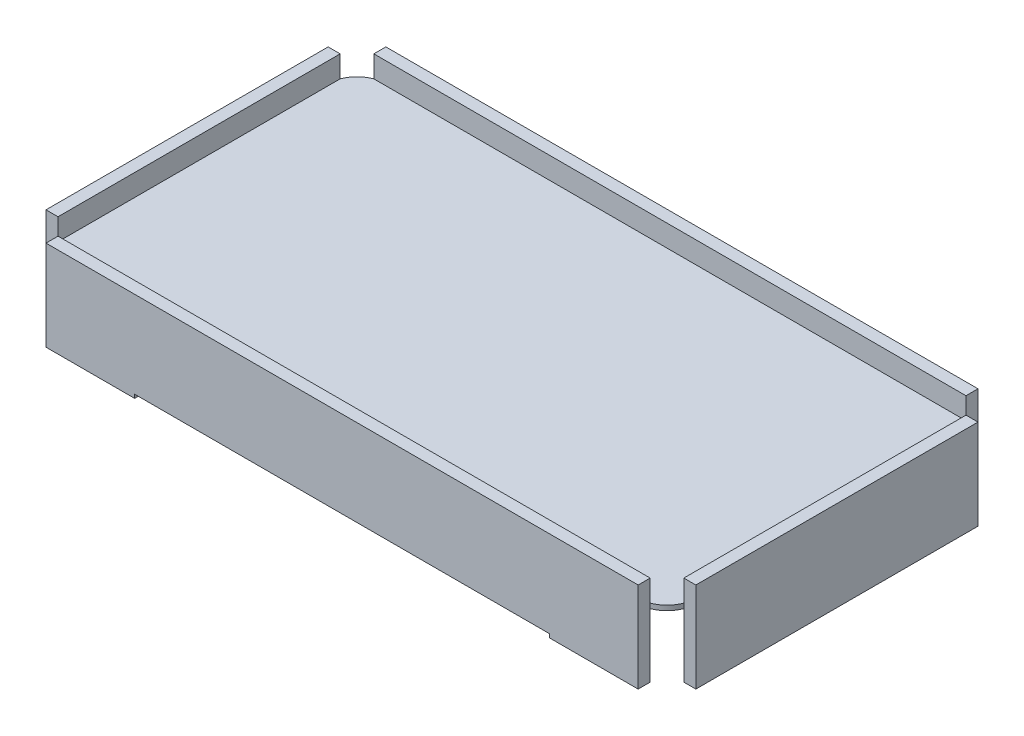
ISO-10303-21;
HEADER;
FILE_DESCRIPTION(('STEP AP214'),'2;1');
FILE_NAME('part.step','',(''),(''),'','','');
FILE_SCHEMA(('AUTOMOTIVE_DESIGN { 1 0 10303 214 1 1 1 1 }'));
ENDSEC;
DATA;
#1=APPLICATION_CONTEXT('core data for automotive mechanical design processes');
#2=APPLICATION_PROTOCOL_DEFINITION('international standard','automotive_design',2000,#1);
#3=PRODUCT_CONTEXT('',#1,'mechanical');
#4=PRODUCT('Part','Part','',(#3));
#5=PRODUCT_RELATED_PRODUCT_CATEGORY('part','',(#4));
#6=PRODUCT_DEFINITION_FORMATION('','',#4);
#7=PRODUCT_DEFINITION_CONTEXT('part definition',#1,'design');
#8=PRODUCT_DEFINITION('design','',#6,#7);
#9=PRODUCT_DEFINITION_SHAPE('','',#8);
#10=(LENGTH_UNIT() NAMED_UNIT(*) SI_UNIT(.MILLI.,.METRE.));
#11=(NAMED_UNIT(*) PLANE_ANGLE_UNIT() SI_UNIT($,.RADIAN.));
#12=(NAMED_UNIT(*) SI_UNIT($,.STERADIAN.) SOLID_ANGLE_UNIT());
#13=UNCERTAINTY_MEASURE_WITH_UNIT(LENGTH_MEASURE(1.E-05),#10,'distance_accuracy_value','');
#14=(GEOMETRIC_REPRESENTATION_CONTEXT(3) GLOBAL_UNCERTAINTY_ASSIGNED_CONTEXT((#13)) GLOBAL_UNIT_ASSIGNED_CONTEXT((#10,
#11,#12)) REPRESENTATION_CONTEXT('',''));
#15=CARTESIAN_POINT('',(0.,0.,0.));
#16=DIRECTION('',(0.,0.,1.));
#17=DIRECTION('',(1.,0.,0.));
#18=AXIS2_PLACEMENT_3D('',#15,#16,#17);
#19=CARTESIAN_POINT('',(0.,0.,0.));
#20=DIRECTION('',(0.,1.,0.));
#21=DIRECTION('',(0.,0.,1.));
#22=AXIS2_PLACEMENT_3D('',#19,#20,#21);
#23=PLANE('',#22);
#24=DIRECTION('',(0.,0.,-1.));
#25=VECTOR('',#24,1.);
#26=CARTESIAN_POINT('',(-215.725,0.,176.75));
#27=LINE('',#26,#25);
#28=CARTESIAN_POINT('',(-215.725,0.,-164.25));
#29=VERTEX_POINT('',#28);
#30=CARTESIAN_POINT('',(-215.725,0.,-176.75));
#31=VERTEX_POINT('',#30);
#32=EDGE_CURVE('E279',#29,#31,#27,.T.);
#33=ORIENTED_EDGE('',*,*,#32,.F.);
#34=DIRECTION('',(1.,0.,0.));
#35=VECTOR('',#34,1.);
#36=CARTESIAN_POINT('',(0.,0.,-164.25));
#37=LINE('',#36,#35);
#38=CARTESIAN_POINT('',(-307.975,0.,-164.25));
#39=VERTEX_POINT('',#38);
#40=EDGE_CURVE('E391',#39,#29,#37,.T.);
#41=ORIENTED_EDGE('',*,*,#40,.F.);
#42=DIRECTION('',(0.,0.,-1.));
#43=VECTOR('',#42,1.);
#44=CARTESIAN_POINT('',(-307.975,0.,0.));
#45=LINE('',#44,#43);
#46=CARTESIAN_POINT('',(-307.975,0.,-176.75));
#47=VERTEX_POINT('',#46);
#48=EDGE_CURVE('E367',#39,#47,#45,.T.);
#49=ORIENTED_EDGE('',*,*,#48,.T.);
#50=DIRECTION('',(1.,0.,0.));
#51=VECTOR('',#50,1.);
#52=CARTESIAN_POINT('',(0.,0.,-176.75));
#53=LINE('',#52,#51);
#54=EDGE_CURVE('E376',#47,#31,#53,.T.);
#55=ORIENTED_EDGE('',*,*,#54,.T.);
#56=EDGE_LOOP('',(#33,#41,#49,#55));
#57=FACE_BOUND('',#56,.T.);
#58=ADVANCED_FACE('F44',(#57),#23,.F.);
#59=CARTESIAN_POINT('',(0.,0.,0.));
#60=DIRECTION('',(0.,1.,0.));
#61=DIRECTION('',(0.,0.,1.));
#62=AXIS2_PLACEMENT_3D('',#59,#60,#61);
#63=PLANE('',#62);
#64=CARTESIAN_POINT('',(-215.725,0.,176.75));
#65=VERTEX_POINT('',#64);
#66=CARTESIAN_POINT('',(-215.725,0.,164.25));
#67=VERTEX_POINT('',#66);
#68=EDGE_CURVE('E256',#65,#67,#27,.T.);
#69=ORIENTED_EDGE('',*,*,#68,.F.);
#70=DIRECTION('',(-1.,0.,0.));
#71=VECTOR('',#70,1.);
#72=CARTESIAN_POINT('',(0.,0.,176.75));
#73=LINE('',#72,#71);
#74=CARTESIAN_POINT('',(-307.975,0.,176.75));
#75=VERTEX_POINT('',#74);
#76=EDGE_CURVE('E272',#65,#75,#73,.T.);
#77=ORIENTED_EDGE('',*,*,#76,.T.);
#78=DIRECTION('',(0.,0.,-1.));
#79=VECTOR('',#78,1.);
#80=CARTESIAN_POINT('',(-307.975,0.,0.));
#81=LINE('',#80,#79);
#82=CARTESIAN_POINT('',(-307.975,0.,164.25));
#83=VERTEX_POINT('',#82);
#84=EDGE_CURVE('E290',#75,#83,#81,.T.);
#85=ORIENTED_EDGE('',*,*,#84,.T.);
#86=DIRECTION('',(-1.,0.,0.));
#87=VECTOR('',#86,1.);
#88=CARTESIAN_POINT('',(0.,0.,164.25));
#89=LINE('',#88,#87);
#90=EDGE_CURVE('E274',#67,#83,#89,.T.);
#91=ORIENTED_EDGE('',*,*,#90,.F.);
#92=EDGE_LOOP('',(#69,#77,#85,#91));
#93=FACE_BOUND('',#92,.T.);
#94=ADVANCED_FACE('F271',(#93),#63,.F.);
#95=CARTESIAN_POINT('',(0.,93.8,-164.25));
#96=DIRECTION('',(0.,0.,-1.));
#97=DIRECTION('',(-1.,0.,0.));
#98=AXIS2_PLACEMENT_3D('',#95,#96,#97);
#99=PLANE('',#98);
#100=DIRECTION('',(0.,1.,0.));
#101=VECTOR('',#100,1.);
#102=CARTESIAN_POINT('',(215.725,93.8,-164.25));
#103=LINE('',#102,#101);
#104=CARTESIAN_POINT('',(215.725,0.,-164.25));
#105=VERTEX_POINT('',#104);
#106=CARTESIAN_POINT('',(215.725,3.80000000000002,-164.25));
#107=VERTEX_POINT('',#106);
#108=EDGE_CURVE('E291',#105,#107,#103,.T.);
#109=ORIENTED_EDGE('',*,*,#108,.F.);
#110=CARTESIAN_POINT('',(307.975,0.,-164.25));
#111=VERTEX_POINT('',#110);
#112=EDGE_CURVE('E388',#105,#111,#37,.T.);
#113=ORIENTED_EDGE('',*,*,#112,.T.);
#114=DIRECTION('',(0.,-1.,0.));
#115=VECTOR('',#114,1.);
#116=CARTESIAN_POINT('',(307.975,93.8,-164.25));
#117=LINE('',#116,#115);
#118=CARTESIAN_POINT('',(307.975,66.25,-164.25));
#119=VERTEX_POINT('',#118);
#120=EDGE_CURVE('E408',#119,#111,#117,.T.);
#121=ORIENTED_EDGE('',*,*,#120,.F.);
#122=DIRECTION('',(-1.,0.,0.));
#123=VECTOR('',#122,1.);
#124=CARTESIAN_POINT('',(-325.475,66.25,-164.25));
#125=LINE('',#124,#123);
#126=CARTESIAN_POINT('',(-307.975,66.25,-164.25));
#127=VERTEX_POINT('',#126);
#128=EDGE_CURVE('E440',#119,#127,#125,.T.);
#129=ORIENTED_EDGE('',*,*,#128,.T.);
#130=DIRECTION('',(0.,-1.,0.));
#131=VECTOR('',#130,1.);
#132=CARTESIAN_POINT('',(-307.975,93.8,-164.25));
#133=LINE('',#132,#131);
#134=EDGE_CURVE('E414',#127,#39,#133,.T.);
#135=ORIENTED_EDGE('',*,*,#134,.T.);
#136=ORIENTED_EDGE('',*,*,#40,.T.);
#137=DIRECTION('',(0.,1.,0.));
#138=VECTOR('',#137,1.);
#139=CARTESIAN_POINT('',(-215.725,93.8,-164.25));
#140=LINE('',#139,#138);
#141=CARTESIAN_POINT('',(-215.725,3.80000000000002,-164.25));
#142=VERTEX_POINT('',#141);
#143=EDGE_CURVE('E550',#29,#142,#140,.T.);
#144=ORIENTED_EDGE('',*,*,#143,.T.);
#145=DIRECTION('',(-1.,0.,0.));
#146=VECTOR('',#145,1.);
#147=CARTESIAN_POINT('',(0.,3.80000000000001,-164.25));
#148=LINE('',#147,#146);
#149=EDGE_CURVE('E543',#107,#142,#148,.T.);
#150=ORIENTED_EDGE('',*,*,#149,.F.);
#151=EDGE_LOOP('',(#109,#113,#121,#129,#135,#136,#144,#150));
#152=FACE_BOUND('',#151,.T.);
#153=ADVANCED_FACE('F637',(#152),#99,.F.);
#154=CARTESIAN_POINT('',(0.,93.8,164.25));
#155=DIRECTION('',(0.,0.,1.));
#156=DIRECTION('',(1.,0.,0.));
#157=AXIS2_PLACEMENT_3D('',#154,#155,#156);
#158=PLANE('',#157);
#159=DIRECTION('',(0.,-1.,0.));
#160=VECTOR('',#159,1.);
#161=CARTESIAN_POINT('',(215.725,93.8,164.25));
#162=LINE('',#161,#160);
#163=CARTESIAN_POINT('',(215.725,3.80000000000002,164.25));
#164=VERTEX_POINT('',#163);
#165=CARTESIAN_POINT('',(215.725,0.,164.25));
#166=VERTEX_POINT('',#165);
#167=EDGE_CURVE('E11',#164,#166,#162,.T.);
#168=ORIENTED_EDGE('',*,*,#167,.F.);
#169=DIRECTION('',(1.,0.,0.));
#170=VECTOR('',#169,1.);
#171=CARTESIAN_POINT('',(0.,3.80000000000001,164.25));
#172=LINE('',#171,#170);
#173=CARTESIAN_POINT('',(-215.725,3.80000000000002,164.25));
#174=VERTEX_POINT('',#173);
#175=EDGE_CURVE('E533',#174,#164,#172,.T.);
#176=ORIENTED_EDGE('',*,*,#175,.F.);
#177=DIRECTION('',(0.,-1.,0.));
#178=VECTOR('',#177,1.);
#179=CARTESIAN_POINT('',(-215.725,93.8,164.25));
#180=LINE('',#179,#178);
#181=EDGE_CURVE('E53',#174,#67,#180,.T.);
#182=ORIENTED_EDGE('',*,*,#181,.T.);
#183=ORIENTED_EDGE('',*,*,#90,.T.);
#184=DIRECTION('',(0.,-1.,0.));
#185=VECTOR('',#184,1.);
#186=CARTESIAN_POINT('',(-307.975,93.8,164.25));
#187=LINE('',#186,#185);
#188=CARTESIAN_POINT('',(-307.975,66.25,164.25));
#189=VERTEX_POINT('',#188);
#190=EDGE_CURVE('E309',#189,#83,#187,.T.);
#191=ORIENTED_EDGE('',*,*,#190,.F.);
#192=DIRECTION('',(1.,0.,0.));
#193=VECTOR('',#192,1.);
#194=CARTESIAN_POINT('',(-325.475,66.25,164.25));
#195=LINE('',#194,#193);
#196=CARTESIAN_POINT('',(307.975,66.25,164.25));
#197=VERTEX_POINT('',#196);
#198=EDGE_CURVE('E428',#189,#197,#195,.T.);
#199=ORIENTED_EDGE('',*,*,#198,.T.);
#200=DIRECTION('',(0.,-1.,0.));
#201=VECTOR('',#200,1.);
#202=CARTESIAN_POINT('',(307.975,93.8,164.25));
#203=LINE('',#202,#201);
#204=CARTESIAN_POINT('',(307.975,0.,164.25));
#205=VERTEX_POINT('',#204);
#206=EDGE_CURVE('E310',#197,#205,#203,.T.);
#207=ORIENTED_EDGE('',*,*,#206,.T.);
#208=EDGE_CURVE('E299',#205,#166,#89,.T.);
#209=ORIENTED_EDGE('',*,*,#208,.T.);
#210=EDGE_LOOP('',(#168,#176,#182,#183,#191,#199,#207,#209));
#211=FACE_BOUND('',#210,.T.);
#212=ADVANCED_FACE('F530',(#211),#158,.F.);
#213=CARTESIAN_POINT('',(-325.475,93.8,0.));
#214=DIRECTION('',(-1.,0.,0.));
#215=DIRECTION('',(0.,0.,1.));
#216=AXIS2_PLACEMENT_3D('',#213,#214,#215);
#217=PLANE('',#216);
#218=DIRECTION('',(0.,0.,1.));
#219=VECTOR('',#218,1.);
#220=CARTESIAN_POINT('',(-325.475,71.25,-164.25));
#221=LINE('',#220,#219);
#222=CARTESIAN_POINT('',(-325.475,71.25,-146.75));
#223=VERTEX_POINT('',#222);
#224=CARTESIAN_POINT('',(-325.475,71.25,146.75));
#225=VERTEX_POINT('',#224);
#226=EDGE_CURVE('E426',#223,#225,#221,.T.);
#227=ORIENTED_EDGE('',*,*,#226,.F.);
#228=DIRECTION('',(0.,-1.,0.));
#229=VECTOR('',#228,1.);
#230=CARTESIAN_POINT('',(-325.475,93.8,-146.75));
#231=LINE('',#230,#229);
#232=CARTESIAN_POINT('',(-325.475,93.8,-146.75));
#233=VERTEX_POINT('',#232);
#234=EDGE_CURVE('E486',#233,#223,#231,.T.);
#235=ORIENTED_EDGE('',*,*,#234,.F.);
#236=DIRECTION('',(0.,0.,-1.));
#237=VECTOR('',#236,1.);
#238=CARTESIAN_POINT('',(-325.475,93.8,0.));
#239=LINE('',#238,#237);
#240=CARTESIAN_POINT('',(-325.475,93.8,146.75));
#241=VERTEX_POINT('',#240);
#242=EDGE_CURVE('E468',#241,#233,#239,.T.);
#243=ORIENTED_EDGE('',*,*,#242,.F.);
#244=DIRECTION('',(0.,-1.,0.));
#245=VECTOR('',#244,1.);
#246=CARTESIAN_POINT('',(-325.475,93.8,146.75));
#247=LINE('',#246,#245);
#248=EDGE_CURVE('E495',#241,#225,#247,.T.);
#249=ORIENTED_EDGE('',*,*,#248,.T.);
#250=EDGE_LOOP('',(#227,#235,#243,#249));
#251=FACE_BOUND('',#250,.T.);
#252=ADVANCED_FACE('F744',(#251),#217,.F.);
#253=CARTESIAN_POINT('',(0.,93.8,-146.75));
#254=DIRECTION('',(0.,0.,-1.));
#255=DIRECTION('',(-1.,0.,0.));
#256=AXIS2_PLACEMENT_3D('',#253,#254,#255);
#257=PLANE('',#256);
#258=DIRECTION('',(1.,0.,0.));
#259=VECTOR('',#258,1.);
#260=CARTESIAN_POINT('',(0.,0.,-146.75));
#261=LINE('',#260,#259);
#262=CARTESIAN_POINT('',(-337.975,0.,-146.75));
#263=VERTEX_POINT('',#262);
#264=CARTESIAN_POINT('',(-325.475,0.,-146.75));
#265=VERTEX_POINT('',#264);
#266=EDGE_CURVE('E442',#263,#265,#261,.T.);
#267=ORIENTED_EDGE('',*,*,#266,.F.);
#268=DIRECTION('',(0.,-1.,0.));
#269=VECTOR('',#268,1.);
#270=CARTESIAN_POINT('',(-337.975,93.8,-146.75));
#271=LINE('',#270,#269);
#272=CARTESIAN_POINT('',(-337.975,93.8,-146.75));
#273=VERTEX_POINT('',#272);
#274=EDGE_CURVE('E430',#273,#263,#271,.T.);
#275=ORIENTED_EDGE('',*,*,#274,.F.);
#276=DIRECTION('',(1.,0.,0.));
#277=VECTOR('',#276,1.);
#278=CARTESIAN_POINT('',(0.,93.8,-146.75));
#279=LINE('',#278,#277);
#280=EDGE_CURVE('E451',#273,#233,#279,.T.);
#281=ORIENTED_EDGE('',*,*,#280,.T.);
#282=ORIENTED_EDGE('',*,*,#234,.T.);
#283=CARTESIAN_POINT('',(-325.475,66.25,-146.75));
#284=VERTEX_POINT('',#283);
#285=EDGE_CURVE('E491',#223,#284,#231,.T.);
#286=ORIENTED_EDGE('',*,*,#285,.T.);
#287=EDGE_CURVE('E473',#284,#265,#231,.T.);
#288=ORIENTED_EDGE('',*,*,#287,.T.);
#289=EDGE_LOOP('',(#267,#275,#281,#282,#286,#288));
#290=FACE_BOUND('',#289,.T.);
#291=ADVANCED_FACE('F746',(#290),#257,.T.);
#292=CARTESIAN_POINT('',(-337.975,93.8,0.));
#293=DIRECTION('',(-1.,0.,0.));
#294=DIRECTION('',(0.,0.,1.));
#295=AXIS2_PLACEMENT_3D('',#292,#293,#294);
#296=PLANE('',#295);
#297=DIRECTION('',(0.,0.,-1.));
#298=VECTOR('',#297,1.);
#299=CARTESIAN_POINT('',(-337.975,0.,0.));
#300=LINE('',#299,#298);
#301=CARTESIAN_POINT('',(-337.975,0.,146.75));
#302=VERTEX_POINT('',#301);
#303=EDGE_CURVE('E474',#302,#263,#300,.T.);
#304=ORIENTED_EDGE('',*,*,#303,.F.);
#305=DIRECTION('',(0.,-1.,0.));
#306=VECTOR('',#305,1.);
#307=CARTESIAN_POINT('',(-337.975,93.8,146.75));
#308=LINE('',#307,#306);
#309=CARTESIAN_POINT('',(-337.975,93.8,146.75));
#310=VERTEX_POINT('',#309);
#311=EDGE_CURVE('E497',#310,#302,#308,.T.);
#312=ORIENTED_EDGE('',*,*,#311,.F.);
#313=DIRECTION('',(0.,0.,-1.));
#314=VECTOR('',#313,1.);
#315=CARTESIAN_POINT('',(-337.975,93.8,0.));
#316=LINE('',#315,#314);
#317=EDGE_CURVE('E459',#310,#273,#316,.T.);
#318=ORIENTED_EDGE('',*,*,#317,.T.);
#319=ORIENTED_EDGE('',*,*,#274,.T.);
#320=EDGE_LOOP('',(#304,#312,#318,#319));
#321=FACE_BOUND('',#320,.T.);
#322=ADVANCED_FACE('F756',(#321),#296,.T.);
#323=CARTESIAN_POINT('',(0.,93.8,146.75));
#324=DIRECTION('',(0.,0.,1.));
#325=DIRECTION('',(1.,0.,0.));
#326=AXIS2_PLACEMENT_3D('',#323,#324,#325);
#327=PLANE('',#326);
#328=DIRECTION('',(-1.,0.,0.));
#329=VECTOR('',#328,1.);
#330=CARTESIAN_POINT('',(0.,0.,146.75));
#331=LINE('',#330,#329);
#332=CARTESIAN_POINT('',(-325.475,0.,146.75));
#333=VERTEX_POINT('',#332);
#334=EDGE_CURVE('E479',#333,#302,#331,.T.);
#335=ORIENTED_EDGE('',*,*,#334,.F.);
#336=CARTESIAN_POINT('',(-325.475,66.25,146.75));
#337=VERTEX_POINT('',#336);
#338=EDGE_CURVE('E489',#337,#333,#247,.T.);
#339=ORIENTED_EDGE('',*,*,#338,.F.);
#340=EDGE_CURVE('E500',#225,#337,#247,.T.);
#341=ORIENTED_EDGE('',*,*,#340,.F.);
#342=ORIENTED_EDGE('',*,*,#248,.F.);
#343=DIRECTION('',(-1.,0.,0.));
#344=VECTOR('',#343,1.);
#345=CARTESIAN_POINT('',(0.,93.8,146.75));
#346=LINE('',#345,#344);
#347=EDGE_CURVE('E463',#241,#310,#346,.T.);
#348=ORIENTED_EDGE('',*,*,#347,.T.);
#349=ORIENTED_EDGE('',*,*,#311,.T.);
#350=EDGE_LOOP('',(#335,#339,#341,#342,#348,#349));
#351=FACE_BOUND('',#350,.T.);
#352=ADVANCED_FACE('F707',(#351),#327,.T.);
#353=ORIENTED_EDGE('',*,*,#287,.F.);
#354=DIRECTION('',(0.,0.,1.));
#355=VECTOR('',#354,1.);
#356=CARTESIAN_POINT('',(-325.475,66.25,-164.25));
#357=LINE('',#356,#355);
#358=EDGE_CURVE('E425',#284,#337,#357,.T.);
#359=ORIENTED_EDGE('',*,*,#358,.T.);
#360=ORIENTED_EDGE('',*,*,#338,.T.);
#361=DIRECTION('',(0.,0.,-1.));
#362=VECTOR('',#361,1.);
#363=CARTESIAN_POINT('',(-325.475,0.,0.));
#364=LINE('',#363,#362);
#365=EDGE_CURVE('E458',#333,#265,#364,.T.);
#366=ORIENTED_EDGE('',*,*,#365,.T.);
#367=EDGE_LOOP('',(#353,#359,#360,#366));
#368=FACE_BOUND('',#367,.T.);
#369=ADVANCED_FACE('F702',(#368),#217,.F.);
#370=CARTESIAN_POINT('',(0.,93.8,0.));
#371=DIRECTION('',(0.,1.,0.));
#372=DIRECTION('',(0.,0.,1.));
#373=AXIS2_PLACEMENT_3D('',#370,#371,#372);
#374=PLANE('',#373);
#375=ORIENTED_EDGE('',*,*,#280,.F.);
#376=ORIENTED_EDGE('',*,*,#317,.F.);
#377=ORIENTED_EDGE('',*,*,#347,.F.);
#378=ORIENTED_EDGE('',*,*,#242,.T.);
#379=EDGE_LOOP('',(#375,#376,#377,#378));
#380=FACE_BOUND('',#379,.T.);
#381=ADVANCED_FACE('F757',(#380),#374,.T.);
#382=CARTESIAN_POINT('',(0.,0.,0.));
#383=DIRECTION('',(0.,1.,0.));
#384=DIRECTION('',(0.,0.,1.));
#385=AXIS2_PLACEMENT_3D('',#382,#383,#384);
#386=PLANE('',#385);
#387=ORIENTED_EDGE('',*,*,#266,.T.);
#388=ORIENTED_EDGE('',*,*,#365,.F.);
#389=ORIENTED_EDGE('',*,*,#334,.T.);
#390=ORIENTED_EDGE('',*,*,#303,.T.);
#391=EDGE_LOOP('',(#387,#388,#389,#390));
#392=FACE_BOUND('',#391,.T.);
#393=ADVANCED_FACE('F751',(#392),#386,.F.);
#394=CARTESIAN_POINT('',(0.,66.25,0.));
#395=DIRECTION('',(0.,1.,0.));
#396=DIRECTION('',(0.,0.,1.));
#397=AXIS2_PLACEMENT_3D('',#394,#395,#396);
#398=PLANE('',#397);
#399=ORIENTED_EDGE('',*,*,#198,.F.);
#400=CARTESIAN_POINT('',(-297.400468957825,66.25,136.175468957825));
#401=DIRECTION('',(0.,1.,0.));
#402=DIRECTION('',(0.,0.,1.));
#403=AXIS2_PLACEMENT_3D('',#400,#401,#402);
#404=CIRCLE('',#403,30.);
#405=EDGE_CURVE('E523',#189,#337,#404,.F.);
#406=ORIENTED_EDGE('',*,*,#405,.T.);
#407=ORIENTED_EDGE('',*,*,#358,.F.);
#408=CARTESIAN_POINT('',(-297.400468957825,66.25,-136.175468957825));
#409=DIRECTION('',(0.,1.,0.));
#410=DIRECTION('',(0.,0.,1.));
#411=AXIS2_PLACEMENT_3D('',#408,#409,#410);
#412=CIRCLE('',#411,30.);
#413=EDGE_CURVE('E519',#284,#127,#412,.F.);
#414=ORIENTED_EDGE('',*,*,#413,.T.);
#415=ORIENTED_EDGE('',*,*,#128,.F.);
#416=CARTESIAN_POINT('',(297.400468957825,66.25,-136.175468957825));
#417=DIRECTION('',(0.,1.,0.));
#418=DIRECTION('',(0.,0.,1.));
#419=AXIS2_PLACEMENT_3D('',#416,#417,#418);
#420=CIRCLE('',#419,30.);
#421=CARTESIAN_POINT('',(325.475,66.25,-146.75));
#422=VERTEX_POINT('',#421);
#423=EDGE_CURVE('E520',#119,#422,#420,.F.);
#424=ORIENTED_EDGE('',*,*,#423,.T.);
#425=DIRECTION('',(0.,0.,-1.));
#426=VECTOR('',#425,1.);
#427=CARTESIAN_POINT('',(325.475,66.25,-164.25));
#428=LINE('',#427,#426);
#429=CARTESIAN_POINT('',(325.475,66.25,146.75));
#430=VERTEX_POINT('',#429);
#431=EDGE_CURVE('E435',#430,#422,#428,.T.);
#432=ORIENTED_EDGE('',*,*,#431,.F.);
#433=CARTESIAN_POINT('',(297.400468957824,66.25,136.175468957825));
#434=DIRECTION('',(0.,1.,0.));
#435=DIRECTION('',(0.,0.,1.));
#436=AXIS2_PLACEMENT_3D('',#433,#434,#435);
#437=CIRCLE('',#436,30.);
#438=EDGE_CURVE('E514',#430,#197,#437,.F.);
#439=ORIENTED_EDGE('',*,*,#438,.T.);
#440=EDGE_LOOP('',(#399,#406,#407,#414,#415,#424,#432,#439));
#441=FACE_BOUND('',#440,.T.);
#442=ADVANCED_FACE('F697',(#441),#398,.F.);
#443=CARTESIAN_POINT('',(0.,71.25,0.));
#444=DIRECTION('',(0.,1.,0.));
#445=DIRECTION('',(0.,0.,1.));
#446=AXIS2_PLACEMENT_3D('',#443,#444,#445);
#447=PLANE('',#446);
#448=ORIENTED_EDGE('',*,*,#226,.T.);
#449=CARTESIAN_POINT('',(-297.400468957825,71.25,136.175468957825));
#450=DIRECTION('',(0.,1.,0.));
#451=DIRECTION('',(0.,0.,1.));
#452=AXIS2_PLACEMENT_3D('',#449,#450,#451);
#453=CIRCLE('',#452,30.);
#454=CARTESIAN_POINT('',(-307.975,71.25,164.25));
#455=VERTEX_POINT('',#454);
#456=EDGE_CURVE('E512',#225,#455,#453,.T.);
#457=ORIENTED_EDGE('',*,*,#456,.T.);
#458=DIRECTION('',(1.,0.,0.));
#459=VECTOR('',#458,1.);
#460=CARTESIAN_POINT('',(-325.475,71.25,164.25));
#461=LINE('',#460,#459);
#462=CARTESIAN_POINT('',(307.975,71.25,164.25));
#463=VERTEX_POINT('',#462);
#464=EDGE_CURVE('E419',#455,#463,#461,.T.);
#465=ORIENTED_EDGE('',*,*,#464,.T.);
#466=CARTESIAN_POINT('',(297.400468957824,71.25,136.175468957825));
#467=DIRECTION('',(0.,1.,0.));
#468=DIRECTION('',(0.,0.,1.));
#469=AXIS2_PLACEMENT_3D('',#466,#467,#468);
#470=CIRCLE('',#469,30.);
#471=CARTESIAN_POINT('',(325.475,71.25,146.75));
#472=VERTEX_POINT('',#471);
#473=EDGE_CURVE('E505',#463,#472,#470,.T.);
#474=ORIENTED_EDGE('',*,*,#473,.T.);
#475=DIRECTION('',(0.,0.,-1.));
#476=VECTOR('',#475,1.);
#477=CARTESIAN_POINT('',(325.475,71.25,-164.25));
#478=LINE('',#477,#476);
#479=CARTESIAN_POINT('',(325.475,71.25,-146.75));
#480=VERTEX_POINT('',#479);
#481=EDGE_CURVE('E447',#472,#480,#478,.T.);
#482=ORIENTED_EDGE('',*,*,#481,.T.);
#483=CARTESIAN_POINT('',(297.400468957825,71.25,-136.175468957825));
#484=DIRECTION('',(0.,1.,0.));
#485=DIRECTION('',(0.,0.,1.));
#486=AXIS2_PLACEMENT_3D('',#483,#484,#485);
#487=CIRCLE('',#486,30.);
#488=CARTESIAN_POINT('',(307.975,71.25,-164.25));
#489=VERTEX_POINT('',#488);
#490=EDGE_CURVE('E504',#480,#489,#487,.T.);
#491=ORIENTED_EDGE('',*,*,#490,.T.);
#492=DIRECTION('',(-1.,0.,0.));
#493=VECTOR('',#492,1.);
#494=CARTESIAN_POINT('',(-325.475,71.25,-164.25));
#495=LINE('',#494,#493);
#496=CARTESIAN_POINT('',(-307.975,71.25,-164.25));
#497=VERTEX_POINT('',#496);
#498=EDGE_CURVE('E433',#489,#497,#495,.T.);
#499=ORIENTED_EDGE('',*,*,#498,.T.);
#500=CARTESIAN_POINT('',(-297.400468957825,71.25,-136.175468957825));
#501=DIRECTION('',(0.,1.,0.));
#502=DIRECTION('',(0.,0.,1.));
#503=AXIS2_PLACEMENT_3D('',#500,#501,#502);
#504=CIRCLE('',#503,30.);
#505=EDGE_CURVE('E508',#497,#223,#504,.T.);
#506=ORIENTED_EDGE('',*,*,#505,.T.);
#507=EDGE_LOOP('',(#448,#457,#465,#474,#482,#491,#499,#506));
#508=FACE_BOUND('',#507,.T.);
#509=ADVANCED_FACE('F690',(#508),#447,.T.);
#510=CARTESIAN_POINT('',(-307.975,93.8,0.));
#511=DIRECTION('',(-1.,0.,0.));
#512=DIRECTION('',(0.,0.,1.));
#513=AXIS2_PLACEMENT_3D('',#510,#511,#512);
#514=PLANE('',#513);
#515=ORIENTED_EDGE('',*,*,#48,.F.);
#516=ORIENTED_EDGE('',*,*,#134,.F.);
#517=EDGE_CURVE('E423',#497,#127,#133,.T.);
#518=ORIENTED_EDGE('',*,*,#517,.F.);
#519=CARTESIAN_POINT('',(-307.975,93.8,-164.25));
#520=VERTEX_POINT('',#519);
#521=EDGE_CURVE('E418',#520,#497,#133,.T.);
#522=ORIENTED_EDGE('',*,*,#521,.F.);
#523=DIRECTION('',(0.,0.,-1.));
#524=VECTOR('',#523,1.);
#525=CARTESIAN_POINT('',(-307.975,93.8,0.));
#526=LINE('',#525,#524);
#527=CARTESIAN_POINT('',(-307.975,93.8,-176.75));
#528=VERTEX_POINT('',#527);
#529=EDGE_CURVE('E371',#520,#528,#526,.T.);
#530=ORIENTED_EDGE('',*,*,#529,.T.);
#531=DIRECTION('',(0.,-1.,0.));
#532=VECTOR('',#531,1.);
#533=CARTESIAN_POINT('',(-307.975,93.8,-176.75));
#534=LINE('',#533,#532);
#535=EDGE_CURVE('E387',#528,#47,#534,.T.);
#536=ORIENTED_EDGE('',*,*,#535,.T.);
#537=EDGE_LOOP('',(#515,#516,#518,#522,#530,#536));
#538=FACE_BOUND('',#537,.T.);
#539=ADVANCED_FACE('F733',(#538),#514,.T.);
#540=ORIENTED_EDGE('',*,*,#498,.F.);
#541=CARTESIAN_POINT('',(307.975,93.8,-164.25));
#542=VERTEX_POINT('',#541);
#543=EDGE_CURVE('E409',#542,#489,#117,.T.);
#544=ORIENTED_EDGE('',*,*,#543,.F.);
#545=DIRECTION('',(1.,0.,0.));
#546=VECTOR('',#545,1.);
#547=CARTESIAN_POINT('',(0.,93.8,-164.25));
#548=LINE('',#547,#546);
#549=EDGE_CURVE('E374',#520,#542,#548,.T.);
#550=ORIENTED_EDGE('',*,*,#549,.F.);
#551=ORIENTED_EDGE('',*,*,#521,.T.);
#552=EDGE_LOOP('',(#540,#544,#550,#551));
#553=FACE_BOUND('',#552,.T.);
#554=ADVANCED_FACE('F737',(#553),#99,.F.);
#555=CARTESIAN_POINT('',(307.975,93.8,0.));
#556=DIRECTION('',(-1.,0.,0.));
#557=DIRECTION('',(0.,0.,1.));
#558=AXIS2_PLACEMENT_3D('',#555,#556,#557);
#559=PLANE('',#558);
#560=DIRECTION('',(0.,0.,-1.));
#561=VECTOR('',#560,1.);
#562=CARTESIAN_POINT('',(307.975,0.,0.));
#563=LINE('',#562,#561);
#564=CARTESIAN_POINT('',(307.975,0.,-176.75));
#565=VERTEX_POINT('',#564);
#566=EDGE_CURVE('E394',#111,#565,#563,.T.);
#567=ORIENTED_EDGE('',*,*,#566,.T.);
#568=DIRECTION('',(0.,-1.,0.));
#569=VECTOR('',#568,1.);
#570=CARTESIAN_POINT('',(307.975,93.8,-176.75));
#571=LINE('',#570,#569);
#572=CARTESIAN_POINT('',(307.975,93.8,-176.75));
#573=VERTEX_POINT('',#572);
#574=EDGE_CURVE('E403',#573,#565,#571,.T.);
#575=ORIENTED_EDGE('',*,*,#574,.F.);
#576=DIRECTION('',(0.,0.,-1.));
#577=VECTOR('',#576,1.);
#578=CARTESIAN_POINT('',(307.975,93.8,0.));
#579=LINE('',#578,#577);
#580=EDGE_CURVE('E377',#542,#573,#579,.T.);
#581=ORIENTED_EDGE('',*,*,#580,.F.);
#582=ORIENTED_EDGE('',*,*,#543,.T.);
#583=EDGE_CURVE('E411',#489,#119,#117,.T.);
#584=ORIENTED_EDGE('',*,*,#583,.T.);
#585=ORIENTED_EDGE('',*,*,#120,.T.);
#586=EDGE_LOOP('',(#567,#575,#581,#582,#584,#585));
#587=FACE_BOUND('',#586,.T.);
#588=ADVANCED_FACE('F810',(#587),#559,.F.);
#589=CARTESIAN_POINT('',(0.,93.8,-176.75));
#590=DIRECTION('',(0.,0.,-1.));
#591=DIRECTION('',(-1.,0.,0.));
#592=AXIS2_PLACEMENT_3D('',#589,#590,#591);
#593=PLANE('',#592);
#594=DIRECTION('',(0.,1.,0.));
#595=VECTOR('',#594,1.);
#596=CARTESIAN_POINT('',(-215.725,0.,-176.75));
#597=LINE('',#596,#595);
#598=CARTESIAN_POINT('',(-215.725,3.80000000000001,-176.75));
#599=VERTEX_POINT('',#598);
#600=EDGE_CURVE('E61',#31,#599,#597,.T.);
#601=ORIENTED_EDGE('',*,*,#600,.F.);
#602=ORIENTED_EDGE('',*,*,#54,.F.);
#603=ORIENTED_EDGE('',*,*,#535,.F.);
#604=DIRECTION('',(1.,0.,0.));
#605=VECTOR('',#604,1.);
#606=CARTESIAN_POINT('',(0.,93.8,-176.75));
#607=LINE('',#606,#605);
#608=EDGE_CURVE('E385',#528,#573,#607,.T.);
#609=ORIENTED_EDGE('',*,*,#608,.T.);
#610=ORIENTED_EDGE('',*,*,#574,.T.);
#611=CARTESIAN_POINT('',(215.725,0.,-176.75));
#612=VERTEX_POINT('',#611);
#613=EDGE_CURVE('E399',#612,#565,#53,.T.);
#614=ORIENTED_EDGE('',*,*,#613,.F.);
#615=DIRECTION('',(0.,1.,0.));
#616=VECTOR('',#615,1.);
#617=CARTESIAN_POINT('',(215.725,0.,-176.75));
#618=LINE('',#617,#616);
#619=CARTESIAN_POINT('',(215.725,3.80000000000002,-176.75));
#620=VERTEX_POINT('',#619);
#621=EDGE_CURVE('E270',#612,#620,#618,.T.);
#622=ORIENTED_EDGE('',*,*,#621,.T.);
#623=DIRECTION('',(-1.,0.,0.));
#624=VECTOR('',#623,1.);
#625=CARTESIAN_POINT('',(0.,3.80000000000002,-176.75));
#626=LINE('',#625,#624);
#627=EDGE_CURVE('E602',#620,#599,#626,.T.);
#628=ORIENTED_EDGE('',*,*,#627,.T.);
#629=EDGE_LOOP('',(#601,#602,#603,#609,#610,#614,#622,#628));
#630=FACE_BOUND('',#629,.T.);
#631=ADVANCED_FACE('F654',(#630),#593,.T.);
#632=CARTESIAN_POINT('',(0.,93.8,0.));
#633=DIRECTION('',(0.,1.,0.));
#634=DIRECTION('',(0.,0.,1.));
#635=AXIS2_PLACEMENT_3D('',#632,#633,#634);
#636=PLANE('',#635);
#637=ORIENTED_EDGE('',*,*,#529,.F.);
#638=ORIENTED_EDGE('',*,*,#549,.T.);
#639=ORIENTED_EDGE('',*,*,#580,.T.);
#640=ORIENTED_EDGE('',*,*,#608,.F.);
#641=EDGE_LOOP('',(#637,#638,#639,#640));
#642=FACE_BOUND('',#641,.T.);
#643=ADVANCED_FACE('F644',(#642),#636,.T.);
#644=ORIENTED_EDGE('',*,*,#112,.F.);
#645=DIRECTION('',(0.,0.,-1.));
#646=VECTOR('',#645,1.);
#647=CARTESIAN_POINT('',(215.725,0.,176.75));
#648=LINE('',#647,#646);
#649=EDGE_CURVE('E608',#105,#612,#648,.T.);
#650=ORIENTED_EDGE('',*,*,#649,.T.);
#651=ORIENTED_EDGE('',*,*,#613,.T.);
#652=ORIENTED_EDGE('',*,*,#566,.F.);
#653=EDGE_LOOP('',(#644,#650,#651,#652));
#654=FACE_BOUND('',#653,.T.);
#655=ADVANCED_FACE('F635',(#654),#23,.F.);
#656=CARTESIAN_POINT('',(325.475,93.8,0.));
#657=DIRECTION('',(1.,0.,0.));
#658=DIRECTION('',(0.,0.,-1.));
#659=AXIS2_PLACEMENT_3D('',#656,#657,#658);
#660=PLANE('',#659);
#661=DIRECTION('',(0.,-1.,0.));
#662=VECTOR('',#661,1.);
#663=CARTESIAN_POINT('',(325.475,93.8,146.75));
#664=LINE('',#663,#662);
#665=CARTESIAN_POINT('',(325.475,0.,146.75));
#666=VERTEX_POINT('',#665);
#667=EDGE_CURVE('E354',#430,#666,#664,.T.);
#668=ORIENTED_EDGE('',*,*,#667,.F.);
#669=ORIENTED_EDGE('',*,*,#431,.T.);
#670=DIRECTION('',(0.,-1.,0.));
#671=VECTOR('',#670,1.);
#672=CARTESIAN_POINT('',(325.475,93.8,-146.75));
#673=LINE('',#672,#671);
#674=CARTESIAN_POINT('',(325.475,0.,-146.75));
#675=VERTEX_POINT('',#674);
#676=EDGE_CURVE('E356',#422,#675,#673,.T.);
#677=ORIENTED_EDGE('',*,*,#676,.T.);
#678=DIRECTION('',(0.,0.,1.));
#679=VECTOR('',#678,1.);
#680=CARTESIAN_POINT('',(325.475,0.,0.));
#681=LINE('',#680,#679);
#682=EDGE_CURVE('E347',#675,#666,#681,.T.);
#683=ORIENTED_EDGE('',*,*,#682,.T.);
#684=EDGE_LOOP('',(#668,#669,#677,#683));
#685=FACE_BOUND('',#684,.T.);
#686=ADVANCED_FACE('F641',(#685),#660,.F.);
#687=CARTESIAN_POINT('',(337.975,93.8,0.));
#688=DIRECTION('',(1.,0.,0.));
#689=DIRECTION('',(0.,0.,-1.));
#690=AXIS2_PLACEMENT_3D('',#687,#688,#689);
#691=PLANE('',#690);
#692=DIRECTION('',(0.,0.,1.));
#693=VECTOR('',#692,1.);
#694=CARTESIAN_POINT('',(337.975,0.,0.));
#695=LINE('',#694,#693);
#696=CARTESIAN_POINT('',(337.975,0.,-146.75));
#697=VERTEX_POINT('',#696);
#698=CARTESIAN_POINT('',(337.975,0.,146.75));
#699=VERTEX_POINT('',#698);
#700=EDGE_CURVE('E325',#697,#699,#695,.T.);
#701=ORIENTED_EDGE('',*,*,#700,.F.);
#702=DIRECTION('',(0.,-1.,0.));
#703=VECTOR('',#702,1.);
#704=CARTESIAN_POINT('',(337.975,93.8,-146.75));
#705=LINE('',#704,#703);
#706=CARTESIAN_POINT('',(337.975,93.8,-146.75));
#707=VERTEX_POINT('',#706);
#708=EDGE_CURVE('E368',#707,#697,#705,.T.);
#709=ORIENTED_EDGE('',*,*,#708,.F.);
#710=DIRECTION('',(0.,0.,1.));
#711=VECTOR('',#710,1.);
#712=CARTESIAN_POINT('',(337.975,93.8,0.));
#713=LINE('',#712,#711);
#714=CARTESIAN_POINT('',(337.975,93.8,146.75));
#715=VERTEX_POINT('',#714);
#716=EDGE_CURVE('E323',#707,#715,#713,.T.);
#717=ORIENTED_EDGE('',*,*,#716,.T.);
#718=DIRECTION('',(0.,-1.,0.));
#719=VECTOR('',#718,1.);
#720=CARTESIAN_POINT('',(337.975,93.8,146.75));
#721=LINE('',#720,#719);
#722=EDGE_CURVE('E337',#715,#699,#721,.T.);
#723=ORIENTED_EDGE('',*,*,#722,.T.);
#724=EDGE_LOOP('',(#701,#709,#717,#723));
#725=FACE_BOUND('',#724,.T.);
#726=ADVANCED_FACE('F649',(#725),#691,.T.);
#727=CARTESIAN_POINT('',(-1.35771024053117E-13,93.8,-146.75));
#728=DIRECTION('',(0.,0.,1.));
#729=DIRECTION('',(1.,0.,0.));
#730=AXIS2_PLACEMENT_3D('',#727,#728,#729);
#731=PLANE('',#730);
#732=DIRECTION('',(-1.,0.,0.));
#733=VECTOR('',#732,1.);
#734=CARTESIAN_POINT('',(-1.35771024053117E-13,0.,-146.75));
#735=LINE('',#734,#733);
#736=EDGE_CURVE('E345',#697,#675,#735,.T.);
#737=ORIENTED_EDGE('',*,*,#736,.T.);
#738=ORIENTED_EDGE('',*,*,#676,.F.);
#739=EDGE_CURVE('E370',#480,#422,#673,.T.);
#740=ORIENTED_EDGE('',*,*,#739,.F.);
#741=CARTESIAN_POINT('',(325.475,93.8,-146.75));
#742=VERTEX_POINT('',#741);
#743=EDGE_CURVE('E362',#742,#480,#673,.T.);
#744=ORIENTED_EDGE('',*,*,#743,.F.);
#745=DIRECTION('',(-1.,0.,0.));
#746=VECTOR('',#745,1.);
#747=CARTESIAN_POINT('',(-1.35771024053117E-13,93.8,-146.75));
#748=LINE('',#747,#746);
#749=EDGE_CURVE('E330',#707,#742,#748,.T.);
#750=ORIENTED_EDGE('',*,*,#749,.F.);
#751=ORIENTED_EDGE('',*,*,#708,.T.);
#752=EDGE_LOOP('',(#737,#738,#740,#744,#750,#751));
#753=FACE_BOUND('',#752,.T.);
#754=ADVANCED_FACE('F723',(#753),#731,.F.);
#755=ORIENTED_EDGE('',*,*,#481,.F.);
#756=CARTESIAN_POINT('',(325.475,93.8,146.75));
#757=VERTEX_POINT('',#756);
#758=EDGE_CURVE('E357',#757,#472,#664,.T.);
#759=ORIENTED_EDGE('',*,*,#758,.F.);
#760=DIRECTION('',(0.,0.,1.));
#761=VECTOR('',#760,1.);
#762=CARTESIAN_POINT('',(325.475,93.8,0.));
#763=LINE('',#762,#761);
#764=EDGE_CURVE('E332',#742,#757,#763,.T.);
#765=ORIENTED_EDGE('',*,*,#764,.F.);
#766=ORIENTED_EDGE('',*,*,#743,.T.);
#767=EDGE_LOOP('',(#755,#759,#765,#766));
#768=FACE_BOUND('',#767,.T.);
#769=ADVANCED_FACE('F653',(#768),#660,.F.);
#770=CARTESIAN_POINT('',(0.,93.8,146.75));
#771=DIRECTION('',(0.,0.,1.));
#772=DIRECTION('',(1.,0.,0.));
#773=AXIS2_PLACEMENT_3D('',#770,#771,#772);
#774=PLANE('',#773);
#775=DIRECTION('',(-1.,0.,0.));
#776=VECTOR('',#775,1.);
#777=CARTESIAN_POINT('',(0.,0.,146.75));
#778=LINE('',#777,#776);
#779=EDGE_CURVE('E327',#699,#666,#778,.T.);
#780=ORIENTED_EDGE('',*,*,#779,.F.);
#781=ORIENTED_EDGE('',*,*,#722,.F.);
#782=DIRECTION('',(-1.,0.,0.));
#783=VECTOR('',#782,1.);
#784=CARTESIAN_POINT('',(0.,93.8,146.75));
#785=LINE('',#784,#783);
#786=EDGE_CURVE('E331',#715,#757,#785,.T.);
#787=ORIENTED_EDGE('',*,*,#786,.T.);
#788=ORIENTED_EDGE('',*,*,#758,.T.);
#789=EDGE_CURVE('E363',#472,#430,#664,.T.);
#790=ORIENTED_EDGE('',*,*,#789,.T.);
#791=ORIENTED_EDGE('',*,*,#667,.T.);
#792=EDGE_LOOP('',(#780,#781,#787,#788,#790,#791));
#793=FACE_BOUND('',#792,.T.);
#794=ADVANCED_FACE('F666',(#793),#774,.T.);
#795=CARTESIAN_POINT('',(0.,93.8,0.));
#796=DIRECTION('',(0.,1.,0.));
#797=DIRECTION('',(0.,0.,1.));
#798=AXIS2_PLACEMENT_3D('',#795,#796,#797);
#799=PLANE('',#798);
#800=ORIENTED_EDGE('',*,*,#716,.F.);
#801=ORIENTED_EDGE('',*,*,#749,.T.);
#802=ORIENTED_EDGE('',*,*,#764,.T.);
#803=ORIENTED_EDGE('',*,*,#786,.F.);
#804=EDGE_LOOP('',(#800,#801,#802,#803));
#805=FACE_BOUND('',#804,.T.);
#806=ADVANCED_FACE('F681',(#805),#799,.T.);
#807=CARTESIAN_POINT('',(0.,0.,0.));
#808=DIRECTION('',(0.,1.,0.));
#809=DIRECTION('',(0.,0.,1.));
#810=AXIS2_PLACEMENT_3D('',#807,#808,#809);
#811=PLANE('',#810);
#812=ORIENTED_EDGE('',*,*,#700,.T.);
#813=ORIENTED_EDGE('',*,*,#779,.T.);
#814=ORIENTED_EDGE('',*,*,#682,.F.);
#815=ORIENTED_EDGE('',*,*,#736,.F.);
#816=EDGE_LOOP('',(#812,#813,#814,#815));
#817=FACE_BOUND('',#816,.T.);
#818=ADVANCED_FACE('F673',(#817),#811,.F.);
#819=CARTESIAN_POINT('',(-307.975,93.8,0.));
#820=DIRECTION('',(-1.,0.,0.));
#821=DIRECTION('',(0.,0.,1.));
#822=AXIS2_PLACEMENT_3D('',#819,#820,#821);
#823=PLANE('',#822);
#824=ORIENTED_EDGE('',*,*,#84,.F.);
#825=DIRECTION('',(0.,-1.,0.));
#826=VECTOR('',#825,1.);
#827=CARTESIAN_POINT('',(-307.975,93.8,176.75));
#828=LINE('',#827,#826);
#829=CARTESIAN_POINT('',(-307.975,93.8,176.75));
#830=VERTEX_POINT('',#829);
#831=EDGE_CURVE('E282',#830,#75,#828,.T.);
#832=ORIENTED_EDGE('',*,*,#831,.F.);
#833=DIRECTION('',(0.,0.,-1.));
#834=VECTOR('',#833,1.);
#835=CARTESIAN_POINT('',(-307.975,93.8,0.));
#836=LINE('',#835,#834);
#837=CARTESIAN_POINT('',(-307.975,93.8,164.25));
#838=VERTEX_POINT('',#837);
#839=EDGE_CURVE('E304',#830,#838,#836,.T.);
#840=ORIENTED_EDGE('',*,*,#839,.T.);
#841=EDGE_CURVE('E301',#838,#455,#187,.T.);
#842=ORIENTED_EDGE('',*,*,#841,.T.);
#843=EDGE_CURVE('E313',#455,#189,#187,.T.);
#844=ORIENTED_EDGE('',*,*,#843,.T.);
#845=ORIENTED_EDGE('',*,*,#190,.T.);
#846=EDGE_LOOP('',(#824,#832,#840,#842,#844,#845));
#847=FACE_BOUND('',#846,.T.);
#848=ADVANCED_FACE('F691',(#847),#823,.T.);
#849=CARTESIAN_POINT('',(0.,93.8,176.75));
#850=DIRECTION('',(0.,0.,1.));
#851=DIRECTION('',(1.,0.,0.));
#852=AXIS2_PLACEMENT_3D('',#849,#850,#851);
#853=PLANE('',#852);
#854=DIRECTION('',(0.,1.,0.));
#855=VECTOR('',#854,1.);
#856=CARTESIAN_POINT('',(215.725,0.,176.75));
#857=LINE('',#856,#855);
#858=CARTESIAN_POINT('',(215.725,0.,176.75));
#859=VERTEX_POINT('',#858);
#860=CARTESIAN_POINT('',(215.725,3.80000000000001,176.75));
#861=VERTEX_POINT('',#860);
#862=EDGE_CURVE('E593',#859,#861,#857,.T.);
#863=ORIENTED_EDGE('',*,*,#862,.F.);
#864=CARTESIAN_POINT('',(307.975,0.,176.75));
#865=VERTEX_POINT('',#864);
#866=EDGE_CURVE('E287',#865,#859,#73,.T.);
#867=ORIENTED_EDGE('',*,*,#866,.F.);
#868=DIRECTION('',(0.,-1.,0.));
#869=VECTOR('',#868,1.);
#870=CARTESIAN_POINT('',(307.975,93.8,176.75));
#871=LINE('',#870,#869);
#872=CARTESIAN_POINT('',(307.975,93.8,176.75));
#873=VERTEX_POINT('',#872);
#874=EDGE_CURVE('E316',#873,#865,#871,.T.);
#875=ORIENTED_EDGE('',*,*,#874,.F.);
#876=DIRECTION('',(-1.,0.,0.));
#877=VECTOR('',#876,1.);
#878=CARTESIAN_POINT('',(0.,93.8,176.75));
#879=LINE('',#878,#877);
#880=EDGE_CURVE('E556',#873,#830,#879,.T.);
#881=ORIENTED_EDGE('',*,*,#880,.T.);
#882=ORIENTED_EDGE('',*,*,#831,.T.);
#883=ORIENTED_EDGE('',*,*,#76,.F.);
#884=DIRECTION('',(0.,1.,0.));
#885=VECTOR('',#884,1.);
#886=CARTESIAN_POINT('',(-215.725,0.,176.75));
#887=LINE('',#886,#885);
#888=CARTESIAN_POINT('',(-215.725,3.80000000000002,176.75));
#889=VERTEX_POINT('',#888);
#890=EDGE_CURVE('E254',#65,#889,#887,.T.);
#891=ORIENTED_EDGE('',*,*,#890,.T.);
#892=DIRECTION('',(-1.,0.,0.));
#893=VECTOR('',#892,1.);
#894=CARTESIAN_POINT('',(0.,3.80000000000002,176.75));
#895=LINE('',#894,#893);
#896=EDGE_CURVE('E266',#861,#889,#895,.T.);
#897=ORIENTED_EDGE('',*,*,#896,.F.);
#898=EDGE_LOOP('',(#863,#867,#875,#881,#882,#883,#891,#897));
#899=FACE_BOUND('',#898,.T.);
#900=ADVANCED_FACE('F281',(#899),#853,.T.);
#901=CARTESIAN_POINT('',(307.975,93.8,0.));
#902=DIRECTION('',(1.,0.,0.));
#903=DIRECTION('',(0.,0.,-1.));
#904=AXIS2_PLACEMENT_3D('',#901,#902,#903);
#905=PLANE('',#904);
#906=DIRECTION('',(0.,0.,1.));
#907=VECTOR('',#906,1.);
#908=CARTESIAN_POINT('',(307.975,0.,0.));
#909=LINE('',#908,#907);
#910=EDGE_CURVE('E295',#205,#865,#909,.T.);
#911=ORIENTED_EDGE('',*,*,#910,.F.);
#912=ORIENTED_EDGE('',*,*,#206,.F.);
#913=EDGE_CURVE('E320',#463,#197,#203,.T.);
#914=ORIENTED_EDGE('',*,*,#913,.F.);
#915=CARTESIAN_POINT('',(307.975,93.8,164.25));
#916=VERTEX_POINT('',#915);
#917=EDGE_CURVE('E315',#916,#463,#203,.T.);
#918=ORIENTED_EDGE('',*,*,#917,.F.);
#919=DIRECTION('',(0.,0.,1.));
#920=VECTOR('',#919,1.);
#921=CARTESIAN_POINT('',(307.975,93.8,0.));
#922=LINE('',#921,#920);
#923=EDGE_CURVE('E558',#916,#873,#922,.T.);
#924=ORIENTED_EDGE('',*,*,#923,.T.);
#925=ORIENTED_EDGE('',*,*,#874,.T.);
#926=EDGE_LOOP('',(#911,#912,#914,#918,#924,#925));
#927=FACE_BOUND('',#926,.T.);
#928=ADVANCED_FACE('F587',(#927),#905,.T.);
#929=ORIENTED_EDGE('',*,*,#464,.F.);
#930=ORIENTED_EDGE('',*,*,#841,.F.);
#931=DIRECTION('',(-1.,0.,0.));
#932=VECTOR('',#931,1.);
#933=CARTESIAN_POINT('',(0.,93.8,164.25));
#934=LINE('',#933,#932);
#935=EDGE_CURVE('E565',#916,#838,#934,.T.);
#936=ORIENTED_EDGE('',*,*,#935,.F.);
#937=ORIENTED_EDGE('',*,*,#917,.T.);
#938=EDGE_LOOP('',(#929,#930,#936,#937));
#939=FACE_BOUND('',#938,.T.);
#940=ADVANCED_FACE('F693',(#939),#158,.F.);
#941=CARTESIAN_POINT('',(0.,93.8,0.));
#942=DIRECTION('',(0.,1.,0.));
#943=DIRECTION('',(0.,0.,1.));
#944=AXIS2_PLACEMENT_3D('',#941,#942,#943);
#945=PLANE('',#944);
#946=ORIENTED_EDGE('',*,*,#839,.F.);
#947=ORIENTED_EDGE('',*,*,#880,.F.);
#948=ORIENTED_EDGE('',*,*,#923,.F.);
#949=ORIENTED_EDGE('',*,*,#935,.T.);
#950=EDGE_LOOP('',(#946,#947,#948,#949));
#951=FACE_BOUND('',#950,.T.);
#952=ADVANCED_FACE('F692',(#951),#945,.T.);
#953=ORIENTED_EDGE('',*,*,#866,.T.);
#954=EDGE_CURVE('E542',#859,#166,#648,.T.);
#955=ORIENTED_EDGE('',*,*,#954,.T.);
#956=ORIENTED_EDGE('',*,*,#208,.F.);
#957=ORIENTED_EDGE('',*,*,#910,.T.);
#958=EDGE_LOOP('',(#953,#955,#956,#957));
#959=FACE_BOUND('',#958,.T.);
#960=ADVANCED_FACE('F589',(#959),#63,.F.);
#961=CARTESIAN_POINT('',(-297.400468957825,66.25,136.175468957825));
#962=DIRECTION('',(0.,1.,0.));
#963=DIRECTION('',(0.,0.,1.));
#964=AXIS2_PLACEMENT_3D('',#961,#962,#963);
#965=CYLINDRICAL_SURFACE('',#964,30.);
#966=ORIENTED_EDGE('',*,*,#405,.F.);
#967=ORIENTED_EDGE('',*,*,#843,.F.);
#968=ORIENTED_EDGE('',*,*,#456,.F.);
#969=ORIENTED_EDGE('',*,*,#340,.T.);
#970=EDGE_LOOP('',(#966,#967,#968,#969));
#971=FACE_BOUND('',#970,.T.);
#972=ADVANCED_FACE('F698',(#971),#965,.T.);
#973=CARTESIAN_POINT('',(-297.400468957825,66.25,-136.175468957825));
#974=DIRECTION('',(0.,1.,0.));
#975=DIRECTION('',(0.,0.,1.));
#976=AXIS2_PLACEMENT_3D('',#973,#974,#975);
#977=CYLINDRICAL_SURFACE('',#976,30.);
#978=ORIENTED_EDGE('',*,*,#413,.F.);
#979=ORIENTED_EDGE('',*,*,#285,.F.);
#980=ORIENTED_EDGE('',*,*,#505,.F.);
#981=ORIENTED_EDGE('',*,*,#517,.T.);
#982=EDGE_LOOP('',(#978,#979,#980,#981));
#983=FACE_BOUND('',#982,.T.);
#984=ADVANCED_FACE('F732',(#983),#977,.T.);
#985=CARTESIAN_POINT('',(297.400468957825,66.25,-136.175468957825));
#986=DIRECTION('',(0.,1.,0.));
#987=DIRECTION('',(0.,0.,1.));
#988=AXIS2_PLACEMENT_3D('',#985,#986,#987);
#989=CYLINDRICAL_SURFACE('',#988,30.);
#990=ORIENTED_EDGE('',*,*,#423,.F.);
#991=ORIENTED_EDGE('',*,*,#583,.F.);
#992=ORIENTED_EDGE('',*,*,#490,.F.);
#993=ORIENTED_EDGE('',*,*,#739,.T.);
#994=EDGE_LOOP('',(#990,#991,#992,#993));
#995=FACE_BOUND('',#994,.T.);
#996=ADVANCED_FACE('F721',(#995),#989,.T.);
#997=CARTESIAN_POINT('',(297.400468957824,66.25,136.175468957825));
#998=DIRECTION('',(0.,1.,0.));
#999=DIRECTION('',(0.,0.,1.));
#1000=AXIS2_PLACEMENT_3D('',#997,#998,#999);
#1001=CYLINDRICAL_SURFACE('',#1000,30.);
#1002=ORIENTED_EDGE('',*,*,#438,.F.);
#1003=ORIENTED_EDGE('',*,*,#789,.F.);
#1004=ORIENTED_EDGE('',*,*,#473,.F.);
#1005=ORIENTED_EDGE('',*,*,#913,.T.);
#1006=EDGE_LOOP('',(#1002,#1003,#1004,#1005));
#1007=FACE_BOUND('',#1006,.T.);
#1008=ADVANCED_FACE('F50',(#1007),#1001,.T.);
#1009=CARTESIAN_POINT('',(0.,3.80000000000002,176.75));
#1010=DIRECTION('',(0.,-1.,0.));
#1011=DIRECTION('',(0.,0.,-1.));
#1012=AXIS2_PLACEMENT_3D('',#1009,#1010,#1011);
#1013=PLANE('',#1012);
#1014=ORIENTED_EDGE('',*,*,#175,.T.);
#1015=DIRECTION('',(0.,0.,-1.));
#1016=VECTOR('',#1015,1.);
#1017=CARTESIAN_POINT('',(215.725,3.80000000000002,176.75));
#1018=LINE('',#1017,#1016);
#1019=EDGE_CURVE('E69',#861,#164,#1018,.T.);
#1020=ORIENTED_EDGE('',*,*,#1019,.F.);
#1021=ORIENTED_EDGE('',*,*,#896,.T.);
#1022=DIRECTION('',(0.,0.,-1.));
#1023=VECTOR('',#1022,1.);
#1024=CARTESIAN_POINT('',(-215.725,3.80000000000002,176.75));
#1025=LINE('',#1024,#1023);
#1026=EDGE_CURVE('E261',#889,#174,#1025,.T.);
#1027=ORIENTED_EDGE('',*,*,#1026,.T.);
#1028=EDGE_LOOP('',(#1014,#1020,#1021,#1027));
#1029=FACE_BOUND('',#1028,.T.);
#1030=ADVANCED_FACE('F535',(#1029),#1013,.T.);
#1031=CARTESIAN_POINT('',(-215.725,0.,176.75));
#1032=DIRECTION('',(-1.,0.,0.));
#1033=DIRECTION('',(0.,0.,1.));
#1034=AXIS2_PLACEMENT_3D('',#1031,#1032,#1033);
#1035=PLANE('',#1034);
#1036=ORIENTED_EDGE('',*,*,#1026,.F.);
#1037=ORIENTED_EDGE('',*,*,#890,.F.);
#1038=ORIENTED_EDGE('',*,*,#68,.T.);
#1039=ORIENTED_EDGE('',*,*,#181,.F.);
#1040=EDGE_LOOP('',(#1036,#1037,#1038,#1039));
#1041=FACE_BOUND('',#1040,.T.);
#1042=ADVANCED_FACE('F260',(#1041),#1035,.F.);
#1043=CARTESIAN_POINT('',(215.725,0.,176.75));
#1044=DIRECTION('',(-1.,0.,0.));
#1045=DIRECTION('',(0.,0.,1.));
#1046=AXIS2_PLACEMENT_3D('',#1043,#1044,#1045);
#1047=PLANE('',#1046);
#1048=ORIENTED_EDGE('',*,*,#167,.T.);
#1049=ORIENTED_EDGE('',*,*,#954,.F.);
#1050=ORIENTED_EDGE('',*,*,#862,.T.);
#1051=ORIENTED_EDGE('',*,*,#1019,.T.);
#1052=EDGE_LOOP('',(#1048,#1049,#1050,#1051));
#1053=FACE_BOUND('',#1052,.T.);
#1054=ADVANCED_FACE('F620',(#1053),#1047,.T.);
#1055=ORIENTED_EDGE('',*,*,#108,.T.);
#1056=EDGE_CURVE('E534',#107,#620,#1018,.T.);
#1057=ORIENTED_EDGE('',*,*,#1056,.T.);
#1058=ORIENTED_EDGE('',*,*,#621,.F.);
#1059=ORIENTED_EDGE('',*,*,#649,.F.);
#1060=EDGE_LOOP('',(#1055,#1057,#1058,#1059));
#1061=FACE_BOUND('',#1060,.T.);
#1062=ADVANCED_FACE('F619',(#1061),#1047,.T.);
#1063=ORIENTED_EDGE('',*,*,#32,.T.);
#1064=ORIENTED_EDGE('',*,*,#600,.T.);
#1065=EDGE_CURVE('E280',#142,#599,#1025,.T.);
#1066=ORIENTED_EDGE('',*,*,#1065,.F.);
#1067=ORIENTED_EDGE('',*,*,#143,.F.);
#1068=EDGE_LOOP('',(#1063,#1064,#1066,#1067));
#1069=FACE_BOUND('',#1068,.T.);
#1070=ADVANCED_FACE('F623',(#1069),#1035,.F.);
#1071=ORIENTED_EDGE('',*,*,#149,.T.);
#1072=ORIENTED_EDGE('',*,*,#1065,.T.);
#1073=ORIENTED_EDGE('',*,*,#627,.F.);
#1074=ORIENTED_EDGE('',*,*,#1056,.F.);
#1075=EDGE_LOOP('',(#1071,#1072,#1073,#1074));
#1076=FACE_BOUND('',#1075,.T.);
#1077=ADVANCED_FACE('F790',(#1076),#1013,.T.);
#1078=CLOSED_SHELL('',(#58,#94,#153,#212,#252,#291,#322,#352,#369,#381,#393,#442,#509,#539,#554,
#588,#631,#643,#655,#686,#726,#754,#769,#794,#806,#818,#848,#900,#928,#940,#952,#960,#972,#984,
#996,#1008,#1030,#1042,#1054,#1062,#1070,#1077));
#1079=MANIFOLD_SOLID_BREP('B2',#1078);
#1080=ADVANCED_BREP_SHAPE_REPRESENTATION('',(#18,#1079),#14);
#1081=SHAPE_DEFINITION_REPRESENTATION(#9,#1080);
ENDSEC;
END-ISO-10303-21;
